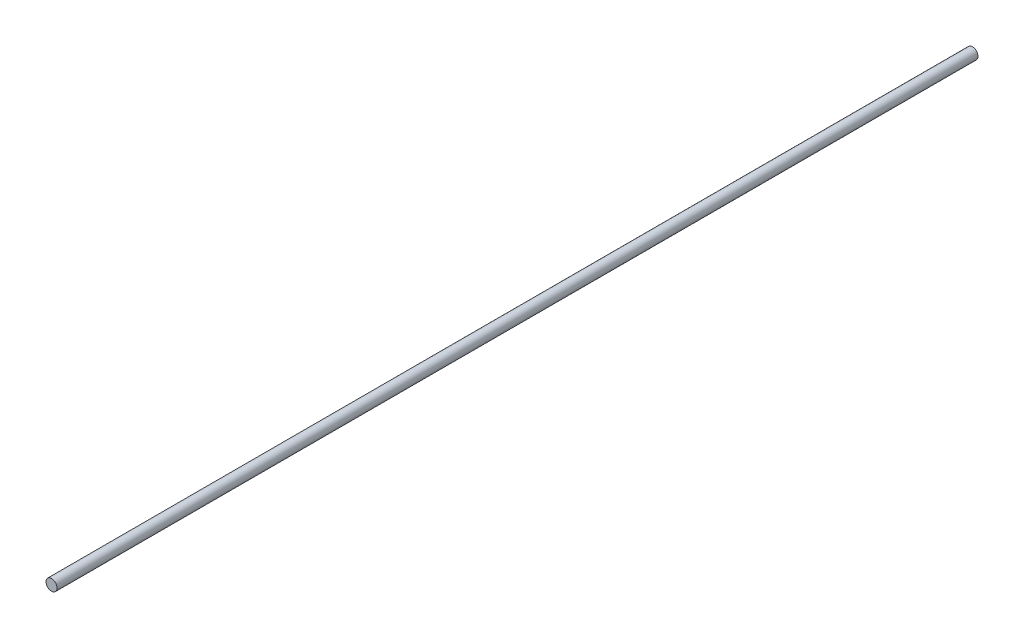
ISO-10303-21;
HEADER;
FILE_DESCRIPTION(('STEP AP214'),'2;1');
FILE_NAME('part.step','',(''),(''),'','','');
FILE_SCHEMA(('AUTOMOTIVE_DESIGN { 1 0 10303 214 1 1 1 1 }'));
ENDSEC;
DATA;
#1=APPLICATION_CONTEXT('core data for automotive mechanical design processes');
#2=APPLICATION_PROTOCOL_DEFINITION('international standard','automotive_design',2000,#1);
#3=PRODUCT_CONTEXT('',#1,'mechanical');
#4=PRODUCT('Part','Part','',(#3));
#5=PRODUCT_RELATED_PRODUCT_CATEGORY('part','',(#4));
#6=PRODUCT_DEFINITION_FORMATION('','',#4);
#7=PRODUCT_DEFINITION_CONTEXT('part definition',#1,'design');
#8=PRODUCT_DEFINITION('design','',#6,#7);
#9=PRODUCT_DEFINITION_SHAPE('','',#8);
#10=(LENGTH_UNIT() NAMED_UNIT(*) SI_UNIT(.MILLI.,.METRE.));
#11=(NAMED_UNIT(*) PLANE_ANGLE_UNIT() SI_UNIT($,.RADIAN.));
#12=(NAMED_UNIT(*) SI_UNIT($,.STERADIAN.) SOLID_ANGLE_UNIT());
#13=UNCERTAINTY_MEASURE_WITH_UNIT(LENGTH_MEASURE(1.E-05),#10,'distance_accuracy_value','');
#14=(GEOMETRIC_REPRESENTATION_CONTEXT(3) GLOBAL_UNCERTAINTY_ASSIGNED_CONTEXT((#13)) GLOBAL_UNIT_ASSIGNED_CONTEXT((#10,
#11,#12)) REPRESENTATION_CONTEXT('',''));
#15=CARTESIAN_POINT('',(0.,0.,0.));
#16=DIRECTION('',(0.,0.,1.));
#17=DIRECTION('',(1.,0.,0.));
#18=AXIS2_PLACEMENT_3D('',#15,#16,#17);
#19=CARTESIAN_POINT('',(0.,0.,-125.));
#20=DIRECTION('',(0.,0.,1.));
#21=DIRECTION('',(1.,0.,0.));
#22=AXIS2_PLACEMENT_3D('',#19,#20,#21);
#23=CYLINDRICAL_SURFACE('',#22,1.5);
#24=CARTESIAN_POINT('',(0.,0.,-125.));
#25=DIRECTION('',(0.,0.,1.));
#26=DIRECTION('',(1.,0.,0.));
#27=AXIS2_PLACEMENT_3D('',#24,#25,#26);
#28=CIRCLE('',#27,1.5);
#29=CARTESIAN_POINT('',(1.5,0.,-125.));
#30=VERTEX_POINT('',#29);
#31=EDGE_CURVE('E10',#30,#30,#28,.T.);
#32=ORIENTED_EDGE('',*,*,#31,.T.);
#33=EDGE_LOOP('',(#32));
#34=FACE_BOUND('',#33,.T.);
#35=CARTESIAN_POINT('',(0.,0.,125.));
#36=DIRECTION('',(0.,0.,1.));
#37=DIRECTION('',(1.,0.,0.));
#38=AXIS2_PLACEMENT_3D('',#35,#36,#37);
#39=CIRCLE('',#38,1.5);
#40=CARTESIAN_POINT('',(1.5,0.,125.));
#41=VERTEX_POINT('',#40);
#42=EDGE_CURVE('E39',#41,#41,#39,.T.);
#43=ORIENTED_EDGE('',*,*,#42,.F.);
#44=EDGE_LOOP('',(#43));
#45=FACE_BOUND('',#44,.T.);
#46=ADVANCED_FACE('F33',(#34,#45),#23,.T.);
#47=CARTESIAN_POINT('',(0.,0.,-125.));
#48=DIRECTION('',(0.,0.,1.));
#49=DIRECTION('',(1.,0.,0.));
#50=AXIS2_PLACEMENT_3D('',#47,#48,#49);
#51=PLANE('',#50);
#52=ORIENTED_EDGE('',*,*,#31,.F.);
#53=EDGE_LOOP('',(#52));
#54=FACE_BOUND('',#53,.T.);
#55=ADVANCED_FACE('F48',(#54),#51,.F.);
#56=CARTESIAN_POINT('',(0.,0.,125.));
#57=DIRECTION('',(0.,0.,1.));
#58=DIRECTION('',(1.,0.,0.));
#59=AXIS2_PLACEMENT_3D('',#56,#57,#58);
#60=PLANE('',#59);
#61=ORIENTED_EDGE('',*,*,#42,.T.);
#62=EDGE_LOOP('',(#61));
#63=FACE_BOUND('',#62,.T.);
#64=ADVANCED_FACE('F45',(#63),#60,.T.);
#65=CLOSED_SHELL('',(#46,#55,#64));
#66=MANIFOLD_SOLID_BREP('B2',#65);
#67=ADVANCED_BREP_SHAPE_REPRESENTATION('',(#18,#66),#14);
#68=SHAPE_DEFINITION_REPRESENTATION(#9,#67);
ENDSEC;
END-ISO-10303-21;
